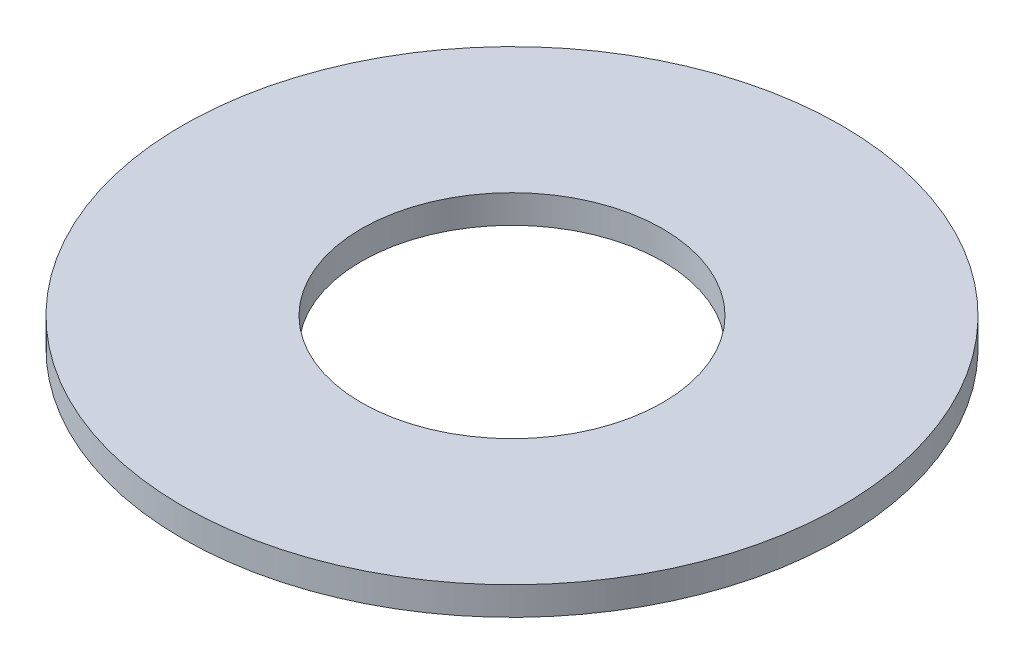
ISO-10303-21;
HEADER;
FILE_DESCRIPTION(('STEP AP214'),'2;1');
FILE_NAME('part.step','',(''),(''),'','','');
FILE_SCHEMA(('AUTOMOTIVE_DESIGN { 1 0 10303 214 1 1 1 1 }'));
ENDSEC;
DATA;
#1=APPLICATION_CONTEXT('core data for automotive mechanical design processes');
#2=APPLICATION_PROTOCOL_DEFINITION('international standard','automotive_design',2000,#1);
#3=PRODUCT_CONTEXT('',#1,'mechanical');
#4=PRODUCT('Part','Part','',(#3));
#5=PRODUCT_RELATED_PRODUCT_CATEGORY('part','',(#4));
#6=PRODUCT_DEFINITION_FORMATION('','',#4);
#7=PRODUCT_DEFINITION_CONTEXT('part definition',#1,'design');
#8=PRODUCT_DEFINITION('design','',#6,#7);
#9=PRODUCT_DEFINITION_SHAPE('','',#8);
#10=(LENGTH_UNIT() NAMED_UNIT(*) SI_UNIT(.MILLI.,.METRE.));
#11=(NAMED_UNIT(*) PLANE_ANGLE_UNIT() SI_UNIT($,.RADIAN.));
#12=(NAMED_UNIT(*) SI_UNIT($,.STERADIAN.) SOLID_ANGLE_UNIT());
#13=UNCERTAINTY_MEASURE_WITH_UNIT(LENGTH_MEASURE(1.E-05),#10,'distance_accuracy_value','');
#14=(GEOMETRIC_REPRESENTATION_CONTEXT(3) GLOBAL_UNCERTAINTY_ASSIGNED_CONTEXT((#13)) GLOBAL_UNIT_ASSIGNED_CONTEXT((#10,
#11,#12)) REPRESENTATION_CONTEXT('',''));
#15=CARTESIAN_POINT('',(0.,0.,0.));
#16=DIRECTION('',(0.,0.,1.));
#17=DIRECTION('',(1.,0.,0.));
#18=AXIS2_PLACEMENT_3D('',#15,#16,#17);
#19=CARTESIAN_POINT('',(0.,0.3,0.));
#20=DIRECTION('',(0.,-1.,0.));
#21=DIRECTION('',(0.,0.,-1.));
#22=AXIS2_PLACEMENT_3D('',#19,#20,#21);
#23=CYLINDRICAL_SURFACE('',#22,3.5);
#24=CARTESIAN_POINT('',(0.,0.3,0.));
#25=DIRECTION('',(0.,1.,0.));
#26=DIRECTION('',(0.,0.,1.));
#27=AXIS2_PLACEMENT_3D('',#24,#25,#26);
#28=CIRCLE('',#27,3.5);
#29=CARTESIAN_POINT('',(0.,0.3,3.5));
#30=VERTEX_POINT('',#29);
#31=EDGE_CURVE('E10',#30,#30,#28,.T.);
#32=ORIENTED_EDGE('',*,*,#31,.F.);
#33=EDGE_LOOP('',(#32));
#34=FACE_BOUND('',#33,.T.);
#35=CARTESIAN_POINT('',(0.,0.,0.));
#36=DIRECTION('',(0.,1.,0.));
#37=DIRECTION('',(0.,0.,1.));
#38=AXIS2_PLACEMENT_3D('',#35,#36,#37);
#39=CIRCLE('',#38,3.5);
#40=CARTESIAN_POINT('',(0.,0.,3.5));
#41=VERTEX_POINT('',#40);
#42=EDGE_CURVE('E32',#41,#41,#39,.T.);
#43=ORIENTED_EDGE('',*,*,#42,.T.);
#44=EDGE_LOOP('',(#43));
#45=FACE_BOUND('',#44,.T.);
#46=ADVANCED_FACE('F29',(#34,#45),#23,.T.);
#47=CARTESIAN_POINT('',(0.,0.3,0.));
#48=DIRECTION('',(0.,1.,0.));
#49=DIRECTION('',(0.,0.,1.));
#50=AXIS2_PLACEMENT_3D('',#47,#48,#49);
#51=PLANE('',#50);
#52=CARTESIAN_POINT('',(0.,0.3,0.));
#53=DIRECTION('',(0.,1.,0.));
#54=DIRECTION('',(0.,0.,1.));
#55=AXIS2_PLACEMENT_3D('',#52,#53,#54);
#56=CIRCLE('',#55,1.6);
#57=CARTESIAN_POINT('',(0.,0.3,1.6));
#58=VERTEX_POINT('',#57);
#59=EDGE_CURVE('E41',#58,#58,#56,.T.);
#60=ORIENTED_EDGE('',*,*,#59,.F.);
#61=EDGE_LOOP('',(#60));
#62=FACE_BOUND('',#61,.T.);
#63=ORIENTED_EDGE('',*,*,#31,.T.);
#64=EDGE_LOOP('',(#63));
#65=FACE_BOUND('',#64,.T.);
#66=ADVANCED_FACE('F56',(#62,#65),#51,.T.);
#67=CARTESIAN_POINT('',(0.,0.,0.));
#68=DIRECTION('',(0.,1.,0.));
#69=DIRECTION('',(0.,0.,1.));
#70=AXIS2_PLACEMENT_3D('',#67,#68,#69);
#71=PLANE('',#70);
#72=CARTESIAN_POINT('',(0.,0.,0.));
#73=DIRECTION('',(0.,1.,0.));
#74=DIRECTION('',(0.,0.,1.));
#75=AXIS2_PLACEMENT_3D('',#72,#73,#74);
#76=CIRCLE('',#75,1.6);
#77=CARTESIAN_POINT('',(0.,0.,1.6));
#78=VERTEX_POINT('',#77);
#79=EDGE_CURVE('E39',#78,#78,#76,.T.);
#80=ORIENTED_EDGE('',*,*,#79,.T.);
#81=EDGE_LOOP('',(#80));
#82=FACE_BOUND('',#81,.T.);
#83=ORIENTED_EDGE('',*,*,#42,.F.);
#84=EDGE_LOOP('',(#83));
#85=FACE_BOUND('',#84,.T.);
#86=ADVANCED_FACE('F47',(#82,#85),#71,.F.);
#87=CARTESIAN_POINT('',(0.,0.,0.));
#88=DIRECTION('',(0.,1.,0.));
#89=DIRECTION('',(0.,0.,1.));
#90=AXIS2_PLACEMENT_3D('',#87,#88,#89);
#91=CYLINDRICAL_SURFACE('',#90,1.6);
#92=ORIENTED_EDGE('',*,*,#79,.F.);
#93=EDGE_LOOP('',(#92));
#94=FACE_BOUND('',#93,.T.);
#95=ORIENTED_EDGE('',*,*,#59,.T.);
#96=EDGE_LOOP('',(#95));
#97=FACE_BOUND('',#96,.T.);
#98=ADVANCED_FACE('F50',(#94,#97),#91,.F.);
#99=CLOSED_SHELL('',(#46,#66,#86,#98));
#100=MANIFOLD_SOLID_BREP('B2',#99);
#101=ADVANCED_BREP_SHAPE_REPRESENTATION('',(#18,#100),#14);
#102=SHAPE_DEFINITION_REPRESENTATION(#9,#101);
ENDSEC;
END-ISO-10303-21;
